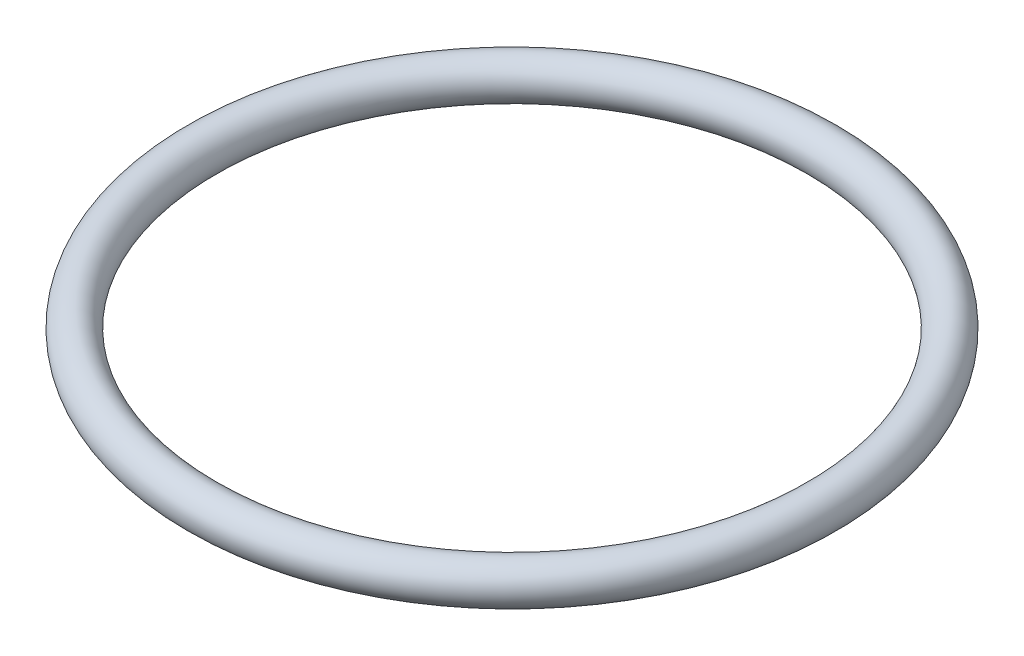
ISO-10303-21;
HEADER;
FILE_DESCRIPTION(('STEP AP214'),'2;1');
FILE_NAME('part.step','',(''),(''),'','','');
FILE_SCHEMA(('AUTOMOTIVE_DESIGN { 1 0 10303 214 1 1 1 1 }'));
ENDSEC;
DATA;
#1=APPLICATION_CONTEXT('core data for automotive mechanical design processes');
#2=APPLICATION_PROTOCOL_DEFINITION('international standard','automotive_design',2000,#1);
#3=PRODUCT_CONTEXT('',#1,'mechanical');
#4=PRODUCT('Part','Part','',(#3));
#5=PRODUCT_RELATED_PRODUCT_CATEGORY('part','',(#4));
#6=PRODUCT_DEFINITION_FORMATION('','',#4);
#7=PRODUCT_DEFINITION_CONTEXT('part definition',#1,'design');
#8=PRODUCT_DEFINITION('design','',#6,#7);
#9=PRODUCT_DEFINITION_SHAPE('','',#8);
#10=(LENGTH_UNIT() NAMED_UNIT(*) SI_UNIT(.MILLI.,.METRE.));
#11=(NAMED_UNIT(*) PLANE_ANGLE_UNIT() SI_UNIT($,.RADIAN.));
#12=(NAMED_UNIT(*) SI_UNIT($,.STERADIAN.) SOLID_ANGLE_UNIT());
#13=UNCERTAINTY_MEASURE_WITH_UNIT(LENGTH_MEASURE(1.E-05),#10,'distance_accuracy_value','');
#14=(GEOMETRIC_REPRESENTATION_CONTEXT(3) GLOBAL_UNCERTAINTY_ASSIGNED_CONTEXT((#13)) GLOBAL_UNIT_ASSIGNED_CONTEXT((#10,
#11,#12)) REPRESENTATION_CONTEXT('',''));
#15=CARTESIAN_POINT('',(0.,0.,0.));
#16=DIRECTION('',(0.,0.,1.));
#17=DIRECTION('',(1.,0.,0.));
#18=AXIS2_PLACEMENT_3D('',#15,#16,#17);
#19=CARTESIAN_POINT('',(0.,0.,0.));
#20=DIRECTION('',(0.,-1.,0.));
#21=DIRECTION('',(0.,0.,-1.));
#22=AXIS2_PLACEMENT_3D('',#19,#20,#21);
#23=TOROIDAL_SURFACE('',#22,20.193,1.3081);
#24=CARTESIAN_POINT('',(0.,0.,-21.5011));
#25=VERTEX_POINT('',#24);
#26=VERTEX_LOOP('',#25);
#27=FACE_BOUND('',#26,.T.);
#28=ADVANCED_FACE('F28',(#27),#23,.T.);
#29=CLOSED_SHELL('',(#28));
#30=MANIFOLD_SOLID_BREP('B2',#29);
#31=ADVANCED_BREP_SHAPE_REPRESENTATION('',(#18,#30),#14);
#32=SHAPE_DEFINITION_REPRESENTATION(#9,#31);
ENDSEC;
END-ISO-10303-21;
